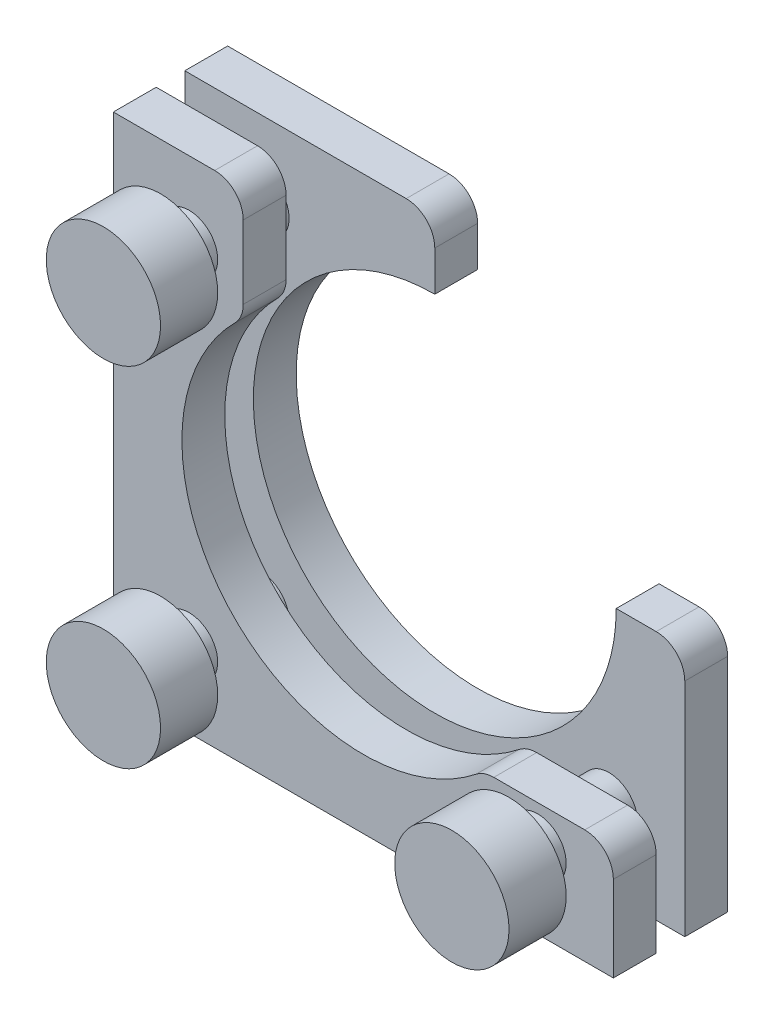
ISO-10303-21;
HEADER;
FILE_DESCRIPTION(('STEP AP214'),'2;1');
FILE_NAME('part.step','',(''),(''),'','','');
FILE_SCHEMA(('AUTOMOTIVE_DESIGN { 1 0 10303 214 1 1 1 1 }'));
ENDSEC;
DATA;
#1=APPLICATION_CONTEXT('core data for automotive mechanical design processes');
#2=APPLICATION_PROTOCOL_DEFINITION('international standard','automotive_design',2000,#1);
#3=PRODUCT_CONTEXT('',#1,'mechanical');
#4=PRODUCT('Part','Part','',(#3));
#5=PRODUCT_RELATED_PRODUCT_CATEGORY('part','',(#4));
#6=PRODUCT_DEFINITION_FORMATION('','',#4);
#7=PRODUCT_DEFINITION_CONTEXT('part definition',#1,'design');
#8=PRODUCT_DEFINITION('design','',#6,#7);
#9=PRODUCT_DEFINITION_SHAPE('','',#8);
#10=(LENGTH_UNIT() NAMED_UNIT(*) SI_UNIT(.MILLI.,.METRE.));
#11=(NAMED_UNIT(*) PLANE_ANGLE_UNIT() SI_UNIT($,.RADIAN.));
#12=(NAMED_UNIT(*) SI_UNIT($,.STERADIAN.) SOLID_ANGLE_UNIT());
#13=UNCERTAINTY_MEASURE_WITH_UNIT(LENGTH_MEASURE(1.E-05),#10,'distance_accuracy_value','');
#14=(GEOMETRIC_REPRESENTATION_CONTEXT(3) GLOBAL_UNCERTAINTY_ASSIGNED_CONTEXT((#13)) GLOBAL_UNIT_ASSIGNED_CONTEXT((#10,
#11,#12)) REPRESENTATION_CONTEXT('',''));
#15=CARTESIAN_POINT('',(0.,0.,0.));
#16=DIRECTION('',(0.,0.,1.));
#17=DIRECTION('',(1.,0.,0.));
#18=AXIS2_PLACEMENT_3D('',#15,#16,#17);
#19=CARTESIAN_POINT('',(0.,0.,3.));
#20=DIRECTION('',(0.,0.,1.));
#21=DIRECTION('',(1.,0.,0.));
#22=AXIS2_PLACEMENT_3D('',#19,#20,#21);
#23=PLANE('',#22);
#24=DIRECTION('',(0.,1.,0.));
#25=VECTOR('',#24,1.);
#26=CARTESIAN_POINT('',(17.5,17.5,3.));
#27=LINE('',#26,#25);
#28=CARTESIAN_POINT('',(17.5,-17.5,3.));
#29=VERTEX_POINT('',#28);
#30=CARTESIAN_POINT('',(17.5,-11.5181144739157,3.));
#31=VERTEX_POINT('',#30);
#32=EDGE_CURVE('E291',#29,#31,#27,.T.);
#33=ORIENTED_EDGE('',*,*,#32,.T.);
#34=CARTESIAN_POINT('',(15.5,-11.5181144739157,3.));
#35=DIRECTION('',(0.,0.,1.));
#36=DIRECTION('',(1.,0.,0.));
#37=AXIS2_PLACEMENT_3D('',#34,#35,#36);
#38=CIRCLE('',#37,2.);
#39=CARTESIAN_POINT('',(15.5,-9.51811447391571,3.));
#40=VERTEX_POINT('',#39);
#41=EDGE_CURVE('E331',#31,#40,#38,.T.);
#42=ORIENTED_EDGE('',*,*,#41,.T.);
#43=DIRECTION('',(1.,0.,0.));
#44=VECTOR('',#43,1.);
#45=CARTESIAN_POINT('',(43.4080614211265,-9.51811447391571,3.));
#46=LINE('',#45,#44);
#47=CARTESIAN_POINT('',(9.13362135003271,-9.51811447391571,3.));
#48=VERTEX_POINT('',#47);
#49=EDGE_CURVE('E208',#48,#40,#46,.T.);
#50=ORIENTED_EDGE('',*,*,#49,.F.);
#51=CARTESIAN_POINT('',(9.13362135003271,-11.5181144739157,3.));
#52=DIRECTION('',(0.,0.,1.));
#53=DIRECTION('',(1.,0.,0.));
#54=AXIS2_PLACEMENT_3D('',#51,#52,#53);
#55=CIRCLE('',#54,2.);
#56=CARTESIAN_POINT('',(7.89095177859969,-9.95102406930133,3.));
#57=VERTEX_POINT('',#56);
#58=EDGE_CURVE('E329',#48,#57,#55,.T.);
#59=ORIENTED_EDGE('',*,*,#58,.T.);
#60=CARTESIAN_POINT('',(0.,0.,3.));
#61=DIRECTION('',(0.,0.,1.));
#62=DIRECTION('',(1.,0.,0.));
#63=AXIS2_PLACEMENT_3D('',#60,#61,#62);
#64=CIRCLE('',#63,12.7);
#65=CARTESIAN_POINT('',(-8.99199864274198,8.96849822483823,3.));
#66=VERTEX_POINT('',#65);
#67=EDGE_CURVE('E284',#66,#57,#64,.T.);
#68=ORIENTED_EDGE('',*,*,#67,.F.);
#69=CARTESIAN_POINT('',(-10.4080614211265,10.3808601500096,3.));
#70=DIRECTION('',(0.,0.,1.));
#71=DIRECTION('',(1.,0.,0.));
#72=AXIS2_PLACEMENT_3D('',#69,#70,#71);
#73=CIRCLE('',#72,2.);
#74=CARTESIAN_POINT('',(-8.40806142112654,10.3808601500096,3.));
#75=VERTEX_POINT('',#74);
#76=EDGE_CURVE('E327',#66,#75,#73,.T.);
#77=ORIENTED_EDGE('',*,*,#76,.T.);
#78=DIRECTION('',(0.,-1.,0.));
#79=VECTOR('',#78,1.);
#80=CARTESIAN_POINT('',(-8.40806142112654,44.5181144739157,3.));
#81=LINE('',#80,#79);
#82=CARTESIAN_POINT('',(-8.40806142112654,15.5,3.));
#83=VERTEX_POINT('',#82);
#84=EDGE_CURVE('E388',#83,#75,#81,.T.);
#85=ORIENTED_EDGE('',*,*,#84,.F.);
#86=CARTESIAN_POINT('',(-10.4080614211265,15.5,3.));
#87=DIRECTION('',(0.,0.,1.));
#88=DIRECTION('',(1.,0.,0.));
#89=AXIS2_PLACEMENT_3D('',#86,#87,#88);
#90=CIRCLE('',#89,2.);
#91=CARTESIAN_POINT('',(-10.4080614211265,17.5,3.));
#92=VERTEX_POINT('',#91);
#93=EDGE_CURVE('E325',#83,#92,#90,.T.);
#94=ORIENTED_EDGE('',*,*,#93,.T.);
#95=DIRECTION('',(-1.,0.,0.));
#96=VECTOR('',#95,1.);
#97=CARTESIAN_POINT('',(-17.5,17.5,3.));
#98=LINE('',#97,#96);
#99=CARTESIAN_POINT('',(-17.5,17.5,3.));
#100=VERTEX_POINT('',#99);
#101=EDGE_CURVE('E294',#92,#100,#98,.T.);
#102=ORIENTED_EDGE('',*,*,#101,.T.);
#103=DIRECTION('',(0.,-1.,0.));
#104=VECTOR('',#103,1.);
#105=CARTESIAN_POINT('',(-17.5,17.5,3.));
#106=LINE('',#105,#104);
#107=CARTESIAN_POINT('',(-17.5,-17.5,3.));
#108=VERTEX_POINT('',#107);
#109=EDGE_CURVE('E297',#100,#108,#106,.T.);
#110=ORIENTED_EDGE('',*,*,#109,.T.);
#111=DIRECTION('',(1.,0.,0.));
#112=VECTOR('',#111,1.);
#113=CARTESIAN_POINT('',(-17.5,-17.5,3.));
#114=LINE('',#113,#112);
#115=EDGE_CURVE('E299',#108,#29,#114,.T.);
#116=ORIENTED_EDGE('',*,*,#115,.T.);
#117=EDGE_LOOP('',(#33,#42,#50,#59,#68,#77,#85,#94,#102,#110,#116));
#118=FACE_BOUND('',#117,.T.);
#119=CARTESIAN_POINT('',(12.1966991411009,-12.1966991411009,3.));
#120=DIRECTION('',(0.,0.,1.));
#121=DIRECTION('',(1.,0.,0.));
#122=AXIS2_PLACEMENT_3D('',#119,#120,#121);
#123=CIRCLE('',#122,2.);
#124=CARTESIAN_POINT('',(14.1966991411009,-12.1966991411009,3.));
#125=VERTEX_POINT('',#124);
#126=EDGE_CURVE('E262',#125,#125,#123,.T.);
#127=ORIENTED_EDGE('',*,*,#126,.F.);
#128=EDGE_LOOP('',(#127));
#129=FACE_BOUND('',#128,.T.);
#130=CARTESIAN_POINT('',(-12.1966991411009,-12.1966991411009,3.));
#131=DIRECTION('',(0.,0.,1.));
#132=DIRECTION('',(1.,0.,0.));
#133=AXIS2_PLACEMENT_3D('',#130,#131,#132);
#134=CIRCLE('',#133,2.);
#135=CARTESIAN_POINT('',(-10.1966991411009,-12.1966991411009,3.));
#136=VERTEX_POINT('',#135);
#137=EDGE_CURVE('E265',#136,#136,#134,.T.);
#138=ORIENTED_EDGE('',*,*,#137,.F.);
#139=EDGE_LOOP('',(#138));
#140=FACE_BOUND('',#139,.T.);
#141=CARTESIAN_POINT('',(-12.1966991411009,12.1966991411009,3.));
#142=DIRECTION('',(0.,0.,1.));
#143=DIRECTION('',(1.,0.,0.));
#144=AXIS2_PLACEMENT_3D('',#141,#142,#143);
#145=CIRCLE('',#144,2.);
#146=CARTESIAN_POINT('',(-10.1966991411009,12.1966991411009,3.));
#147=VERTEX_POINT('',#146);
#148=EDGE_CURVE('E274',#147,#147,#145,.T.);
#149=ORIENTED_EDGE('',*,*,#148,.F.);
#150=EDGE_LOOP('',(#149));
#151=FACE_BOUND('',#150,.T.);
#152=ADVANCED_FACE('F36',(#118,#129,#140,#151),#23,.T.);
#153=CARTESIAN_POINT('',(0.,0.,0.));
#154=DIRECTION('',(0.,0.,1.));
#155=DIRECTION('',(1.,0.,0.));
#156=AXIS2_PLACEMENT_3D('',#153,#154,#155);
#157=PLANE('',#156);
#158=CARTESIAN_POINT('',(12.1966991411009,-12.1966991411009,0.));
#159=DIRECTION('',(0.,0.,1.));
#160=DIRECTION('',(1.,0.,0.));
#161=AXIS2_PLACEMENT_3D('',#158,#159,#160);
#162=CIRCLE('',#161,2.);
#163=CARTESIAN_POINT('',(14.1966991411009,-12.1966991411009,0.));
#164=VERTEX_POINT('',#163);
#165=EDGE_CURVE('E261',#164,#164,#162,.T.);
#166=ORIENTED_EDGE('',*,*,#165,.T.);
#167=EDGE_LOOP('',(#166));
#168=FACE_BOUND('',#167,.T.);
#169=CARTESIAN_POINT('',(-12.1966991411009,-12.1966991411009,0.));
#170=DIRECTION('',(0.,0.,1.));
#171=DIRECTION('',(1.,0.,0.));
#172=AXIS2_PLACEMENT_3D('',#169,#170,#171);
#173=CIRCLE('',#172,2.);
#174=CARTESIAN_POINT('',(-10.1966991411009,-12.1966991411009,0.));
#175=VERTEX_POINT('',#174);
#176=EDGE_CURVE('E271',#175,#175,#173,.T.);
#177=ORIENTED_EDGE('',*,*,#176,.T.);
#178=EDGE_LOOP('',(#177));
#179=FACE_BOUND('',#178,.T.);
#180=CARTESIAN_POINT('',(-12.1966991411009,12.1966991411009,0.));
#181=DIRECTION('',(0.,0.,1.));
#182=DIRECTION('',(1.,0.,0.));
#183=AXIS2_PLACEMENT_3D('',#180,#181,#182);
#184=CIRCLE('',#183,2.);
#185=CARTESIAN_POINT('',(-10.1966991411009,12.1966991411009,0.));
#186=VERTEX_POINT('',#185);
#187=EDGE_CURVE('E278',#186,#186,#184,.T.);
#188=ORIENTED_EDGE('',*,*,#187,.T.);
#189=EDGE_LOOP('',(#188));
#190=FACE_BOUND('',#189,.T.);
#191=DIRECTION('',(1.,0.,0.));
#192=VECTOR('',#191,1.);
#193=CARTESIAN_POINT('',(43.4080614211265,-9.51811447391571,0.));
#194=LINE('',#193,#192);
#195=CARTESIAN_POINT('',(9.13362135003271,-9.51811447391571,0.));
#196=VERTEX_POINT('',#195);
#197=CARTESIAN_POINT('',(15.5,-9.51811447391571,0.));
#198=VERTEX_POINT('',#197);
#199=EDGE_CURVE('E205',#196,#198,#194,.T.);
#200=ORIENTED_EDGE('',*,*,#199,.T.);
#201=CARTESIAN_POINT('',(15.5,-11.5181144739157,0.));
#202=DIRECTION('',(0.,0.,1.));
#203=DIRECTION('',(1.,0.,0.));
#204=AXIS2_PLACEMENT_3D('',#201,#202,#203);
#205=CIRCLE('',#204,2.);
#206=CARTESIAN_POINT('',(17.5,-11.5181144739157,0.));
#207=VERTEX_POINT('',#206);
#208=EDGE_CURVE('E344',#198,#207,#205,.F.);
#209=ORIENTED_EDGE('',*,*,#208,.T.);
#210=DIRECTION('',(0.,1.,0.));
#211=VECTOR('',#210,1.);
#212=CARTESIAN_POINT('',(17.5,17.5,0.));
#213=LINE('',#212,#211);
#214=CARTESIAN_POINT('',(17.5,-17.5,0.));
#215=VERTEX_POINT('',#214);
#216=EDGE_CURVE('E287',#215,#207,#213,.T.);
#217=ORIENTED_EDGE('',*,*,#216,.F.);
#218=DIRECTION('',(1.,0.,0.));
#219=VECTOR('',#218,1.);
#220=CARTESIAN_POINT('',(-17.5,-17.5,0.));
#221=LINE('',#220,#219);
#222=CARTESIAN_POINT('',(-17.5,-17.5,0.));
#223=VERTEX_POINT('',#222);
#224=EDGE_CURVE('E295',#223,#215,#221,.T.);
#225=ORIENTED_EDGE('',*,*,#224,.F.);
#226=DIRECTION('',(0.,-1.,0.));
#227=VECTOR('',#226,1.);
#228=CARTESIAN_POINT('',(-17.5,17.5,0.));
#229=LINE('',#228,#227);
#230=CARTESIAN_POINT('',(-17.5,17.5,0.));
#231=VERTEX_POINT('',#230);
#232=EDGE_CURVE('E306',#231,#223,#229,.T.);
#233=ORIENTED_EDGE('',*,*,#232,.F.);
#234=DIRECTION('',(-1.,0.,0.));
#235=VECTOR('',#234,1.);
#236=CARTESIAN_POINT('',(-17.5,17.5,0.));
#237=LINE('',#236,#235);
#238=CARTESIAN_POINT('',(-10.4080614211265,17.5,0.));
#239=VERTEX_POINT('',#238);
#240=EDGE_CURVE('E304',#239,#231,#237,.T.);
#241=ORIENTED_EDGE('',*,*,#240,.F.);
#242=CARTESIAN_POINT('',(-10.4080614211265,15.5,0.));
#243=DIRECTION('',(0.,0.,1.));
#244=DIRECTION('',(1.,0.,0.));
#245=AXIS2_PLACEMENT_3D('',#242,#243,#244);
#246=CIRCLE('',#245,2.);
#247=CARTESIAN_POINT('',(-8.40806142112654,15.5,0.));
#248=VERTEX_POINT('',#247);
#249=EDGE_CURVE('E338',#239,#248,#246,.F.);
#250=ORIENTED_EDGE('',*,*,#249,.T.);
#251=DIRECTION('',(0.,-1.,0.));
#252=VECTOR('',#251,1.);
#253=CARTESIAN_POINT('',(-8.40806142112654,44.5181144739157,0.));
#254=LINE('',#253,#252);
#255=CARTESIAN_POINT('',(-8.40806142112654,10.3808601500096,0.));
#256=VERTEX_POINT('',#255);
#257=EDGE_CURVE('E392',#248,#256,#254,.T.);
#258=ORIENTED_EDGE('',*,*,#257,.T.);
#259=CARTESIAN_POINT('',(-10.4080614211265,10.3808601500096,0.));
#260=DIRECTION('',(0.,0.,1.));
#261=DIRECTION('',(1.,0.,0.));
#262=AXIS2_PLACEMENT_3D('',#259,#260,#261);
#263=CIRCLE('',#262,2.);
#264=CARTESIAN_POINT('',(-8.99199864274198,8.96849822483823,0.));
#265=VERTEX_POINT('',#264);
#266=EDGE_CURVE('E340',#256,#265,#263,.F.);
#267=ORIENTED_EDGE('',*,*,#266,.T.);
#268=CARTESIAN_POINT('',(0.,0.,0.));
#269=DIRECTION('',(0.,0.,1.));
#270=DIRECTION('',(1.,0.,0.));
#271=AXIS2_PLACEMENT_3D('',#268,#269,#270);
#272=CIRCLE('',#271,12.7);
#273=CARTESIAN_POINT('',(7.89095177859969,-9.95102406930133,0.));
#274=VERTEX_POINT('',#273);
#275=EDGE_CURVE('E288',#265,#274,#272,.T.);
#276=ORIENTED_EDGE('',*,*,#275,.T.);
#277=CARTESIAN_POINT('',(9.13362135003271,-11.5181144739157,0.));
#278=DIRECTION('',(0.,0.,1.));
#279=DIRECTION('',(1.,0.,0.));
#280=AXIS2_PLACEMENT_3D('',#277,#278,#279);
#281=CIRCLE('',#280,2.);
#282=EDGE_CURVE('E342',#274,#196,#281,.F.);
#283=ORIENTED_EDGE('',*,*,#282,.T.);
#284=EDGE_LOOP('',(#200,#209,#217,#225,#233,#241,#250,#258,#267,#276,#283));
#285=FACE_BOUND('',#284,.T.);
#286=ADVANCED_FACE('F414',(#168,#179,#190,#285),#157,.F.);
#287=CARTESIAN_POINT('',(17.5,17.5,3.));
#288=DIRECTION('',(-1.,0.,0.));
#289=DIRECTION('',(0.,-1.,0.));
#290=AXIS2_PLACEMENT_3D('',#287,#288,#289);
#291=PLANE('',#290);
#292=ORIENTED_EDGE('',*,*,#216,.T.);
#293=DIRECTION('',(0.,0.,1.));
#294=VECTOR('',#293,1.);
#295=CARTESIAN_POINT('',(17.5,-11.5181144739157,3.));
#296=LINE('',#295,#294);
#297=EDGE_CURVE('E183',#207,#31,#296,.T.);
#298=ORIENTED_EDGE('',*,*,#297,.T.);
#299=ORIENTED_EDGE('',*,*,#32,.F.);
#300=DIRECTION('',(0.,0.,-1.));
#301=VECTOR('',#300,1.);
#302=CARTESIAN_POINT('',(17.5,-17.5,3.));
#303=LINE('',#302,#301);
#304=EDGE_CURVE('E301',#29,#215,#303,.T.);
#305=ORIENTED_EDGE('',*,*,#304,.T.);
#306=EDGE_LOOP('',(#292,#298,#299,#305));
#307=FACE_BOUND('',#306,.T.);
#308=ADVANCED_FACE('F417',(#307),#291,.F.);
#309=CARTESIAN_POINT('',(-17.5,17.5,3.));
#310=DIRECTION('',(0.,-1.,0.));
#311=DIRECTION('',(0.,0.,-1.));
#312=AXIS2_PLACEMENT_3D('',#309,#310,#311);
#313=PLANE('',#312);
#314=ORIENTED_EDGE('',*,*,#101,.F.);
#315=DIRECTION('',(0.,0.,-1.));
#316=VECTOR('',#315,1.);
#317=CARTESIAN_POINT('',(-10.4080614211265,17.5,3.));
#318=LINE('',#317,#316);
#319=EDGE_CURVE('E355',#92,#239,#318,.T.);
#320=ORIENTED_EDGE('',*,*,#319,.T.);
#321=ORIENTED_EDGE('',*,*,#240,.T.);
#322=DIRECTION('',(0.,0.,-1.));
#323=VECTOR('',#322,1.);
#324=CARTESIAN_POINT('',(-17.5,17.5,3.));
#325=LINE('',#324,#323);
#326=EDGE_CURVE('E283',#100,#231,#325,.T.);
#327=ORIENTED_EDGE('',*,*,#326,.F.);
#328=EDGE_LOOP('',(#314,#320,#321,#327));
#329=FACE_BOUND('',#328,.T.);
#330=ADVANCED_FACE('F432',(#329),#313,.F.);
#331=CARTESIAN_POINT('',(-17.5,17.5,3.));
#332=DIRECTION('',(1.,0.,0.));
#333=DIRECTION('',(0.,1.,0.));
#334=AXIS2_PLACEMENT_3D('',#331,#332,#333);
#335=PLANE('',#334);
#336=ORIENTED_EDGE('',*,*,#232,.T.);
#337=DIRECTION('',(0.,0.,-1.));
#338=VECTOR('',#337,1.);
#339=CARTESIAN_POINT('',(-17.5,-17.5,3.));
#340=LINE('',#339,#338);
#341=EDGE_CURVE('E311',#108,#223,#340,.T.);
#342=ORIENTED_EDGE('',*,*,#341,.F.);
#343=ORIENTED_EDGE('',*,*,#109,.F.);
#344=ORIENTED_EDGE('',*,*,#326,.T.);
#345=EDGE_LOOP('',(#336,#342,#343,#344));
#346=FACE_BOUND('',#345,.T.);
#347=ADVANCED_FACE('F427',(#346),#335,.F.);
#348=CARTESIAN_POINT('',(-17.5,-17.5,3.));
#349=DIRECTION('',(0.,1.,0.));
#350=DIRECTION('',(0.,0.,1.));
#351=AXIS2_PLACEMENT_3D('',#348,#349,#350);
#352=PLANE('',#351);
#353=ORIENTED_EDGE('',*,*,#224,.T.);
#354=ORIENTED_EDGE('',*,*,#304,.F.);
#355=ORIENTED_EDGE('',*,*,#115,.F.);
#356=ORIENTED_EDGE('',*,*,#341,.T.);
#357=EDGE_LOOP('',(#353,#354,#355,#356));
#358=FACE_BOUND('',#357,.T.);
#359=ADVANCED_FACE('F422',(#358),#352,.F.);
#360=CARTESIAN_POINT('',(0.,0.,3.));
#361=DIRECTION('',(0.,0.,-1.));
#362=DIRECTION('',(-1.,0.,0.));
#363=AXIS2_PLACEMENT_3D('',#360,#361,#362);
#364=CYLINDRICAL_SURFACE('',#363,12.7);
#365=ORIENTED_EDGE('',*,*,#67,.T.);
#366=DIRECTION('',(0.,0.,-1.));
#367=VECTOR('',#366,1.);
#368=CARTESIAN_POINT('',(7.89095177859969,-9.95102406930133,3.));
#369=LINE('',#368,#367);
#370=EDGE_CURVE('E348',#57,#274,#369,.T.);
#371=ORIENTED_EDGE('',*,*,#370,.T.);
#372=ORIENTED_EDGE('',*,*,#275,.F.);
#373=DIRECTION('',(0.,0.,-1.));
#374=VECTOR('',#373,1.);
#375=CARTESIAN_POINT('',(-8.99199864274198,8.96849822483823,3.));
#376=LINE('',#375,#374);
#377=EDGE_CURVE('E346',#265,#66,#376,.F.);
#378=ORIENTED_EDGE('',*,*,#377,.T.);
#379=EDGE_LOOP('',(#365,#371,#372,#378));
#380=FACE_BOUND('',#379,.T.);
#381=ADVANCED_FACE('F447',(#380),#364,.F.);
#382=CARTESIAN_POINT('',(-12.1966991411009,12.1966991411009,-2.));
#383=DIRECTION('',(0.,0.,1.));
#384=DIRECTION('',(1.,0.,0.));
#385=AXIS2_PLACEMENT_3D('',#382,#383,#384);
#386=CYLINDRICAL_SURFACE('',#385,2.);
#387=CARTESIAN_POINT('',(-12.1966991411009,12.1966991411009,-2.));
#388=DIRECTION('',(0.,0.,1.));
#389=DIRECTION('',(1.,0.,0.));
#390=AXIS2_PLACEMENT_3D('',#387,#388,#389);
#391=CIRCLE('',#390,2.);
#392=CARTESIAN_POINT('',(-10.1966991411009,12.1966991411009,-2.));
#393=VERTEX_POINT('',#392);
#394=EDGE_CURVE('E243',#393,#393,#391,.T.);
#395=ORIENTED_EDGE('',*,*,#394,.T.);
#396=EDGE_LOOP('',(#395));
#397=FACE_BOUND('',#396,.T.);
#398=ORIENTED_EDGE('',*,*,#187,.F.);
#399=EDGE_LOOP('',(#398));
#400=FACE_BOUND('',#399,.T.);
#401=ADVANCED_FACE('F465',(#397,#400),#386,.T.);
#402=ORIENTED_EDGE('',*,*,#148,.T.);
#403=EDGE_LOOP('',(#402));
#404=FACE_BOUND('',#403,.T.);
#405=CARTESIAN_POINT('',(-12.1966991411009,12.1966991411009,5.));
#406=DIRECTION('',(0.,0.,1.));
#407=DIRECTION('',(1.,0.,0.));
#408=AXIS2_PLACEMENT_3D('',#405,#406,#407);
#409=CIRCLE('',#408,2.);
#410=CARTESIAN_POINT('',(-10.1966991411009,12.1966991411009,5.));
#411=VERTEX_POINT('',#410);
#412=EDGE_CURVE('E275',#411,#411,#409,.T.);
#413=ORIENTED_EDGE('',*,*,#412,.F.);
#414=EDGE_LOOP('',(#413));
#415=FACE_BOUND('',#414,.T.);
#416=ADVANCED_FACE('F461',(#404,#415),#386,.T.);
#417=CARTESIAN_POINT('',(-12.1966991411009,-12.1966991411009,-2.));
#418=DIRECTION('',(0.,0.,1.));
#419=DIRECTION('',(1.,0.,0.));
#420=AXIS2_PLACEMENT_3D('',#417,#418,#419);
#421=CYLINDRICAL_SURFACE('',#420,2.);
#422=CARTESIAN_POINT('',(-12.1966991411009,-12.1966991411009,-2.));
#423=DIRECTION('',(0.,0.,1.));
#424=DIRECTION('',(1.,0.,0.));
#425=AXIS2_PLACEMENT_3D('',#422,#423,#424);
#426=CIRCLE('',#425,2.);
#427=CARTESIAN_POINT('',(-10.1966991411009,-12.1966991411009,-2.));
#428=VERTEX_POINT('',#427);
#429=EDGE_CURVE('E258',#428,#428,#426,.T.);
#430=ORIENTED_EDGE('',*,*,#429,.T.);
#431=EDGE_LOOP('',(#430));
#432=FACE_BOUND('',#431,.T.);
#433=ORIENTED_EDGE('',*,*,#176,.F.);
#434=EDGE_LOOP('',(#433));
#435=FACE_BOUND('',#434,.T.);
#436=ADVANCED_FACE('F464',(#432,#435),#421,.T.);
#437=ORIENTED_EDGE('',*,*,#137,.T.);
#438=EDGE_LOOP('',(#437));
#439=FACE_BOUND('',#438,.T.);
#440=CARTESIAN_POINT('',(-12.1966991411009,-12.1966991411009,5.));
#441=DIRECTION('',(0.,0.,1.));
#442=DIRECTION('',(1.,0.,0.));
#443=AXIS2_PLACEMENT_3D('',#440,#441,#442);
#444=CIRCLE('',#443,2.);
#445=CARTESIAN_POINT('',(-10.1966991411009,-12.1966991411009,5.));
#446=VERTEX_POINT('',#445);
#447=EDGE_CURVE('E268',#446,#446,#444,.T.);
#448=ORIENTED_EDGE('',*,*,#447,.F.);
#449=EDGE_LOOP('',(#448));
#450=FACE_BOUND('',#449,.T.);
#451=ADVANCED_FACE('F493',(#439,#450),#421,.T.);
#452=CARTESIAN_POINT('',(12.1966991411009,-12.1966991411009,-2.));
#453=DIRECTION('',(0.,0.,1.));
#454=DIRECTION('',(1.,0.,0.));
#455=AXIS2_PLACEMENT_3D('',#452,#453,#454);
#456=CYLINDRICAL_SURFACE('',#455,2.);
#457=CARTESIAN_POINT('',(12.1966991411009,-12.1966991411009,-2.));
#458=DIRECTION('',(0.,0.,1.));
#459=DIRECTION('',(1.,0.,0.));
#460=AXIS2_PLACEMENT_3D('',#457,#458,#459);
#461=CIRCLE('',#460,2.);
#462=CARTESIAN_POINT('',(14.1966991411009,-12.1966991411009,-2.));
#463=VERTEX_POINT('',#462);
#464=EDGE_CURVE('E235',#463,#463,#461,.T.);
#465=ORIENTED_EDGE('',*,*,#464,.T.);
#466=EDGE_LOOP('',(#465));
#467=FACE_BOUND('',#466,.T.);
#468=ORIENTED_EDGE('',*,*,#165,.F.);
#469=EDGE_LOOP('',(#468));
#470=FACE_BOUND('',#469,.T.);
#471=ADVANCED_FACE('F488',(#467,#470),#456,.T.);
#472=ORIENTED_EDGE('',*,*,#126,.T.);
#473=EDGE_LOOP('',(#472));
#474=FACE_BOUND('',#473,.T.);
#475=CARTESIAN_POINT('',(12.1966991411009,-12.1966991411009,5.));
#476=DIRECTION('',(0.,0.,1.));
#477=DIRECTION('',(1.,0.,0.));
#478=AXIS2_PLACEMENT_3D('',#475,#476,#477);
#479=CIRCLE('',#478,2.);
#480=CARTESIAN_POINT('',(14.1966991411009,-12.1966991411009,5.));
#481=VERTEX_POINT('',#480);
#482=EDGE_CURVE('E253',#481,#481,#479,.T.);
#483=ORIENTED_EDGE('',*,*,#482,.F.);
#484=EDGE_LOOP('',(#483));
#485=FACE_BOUND('',#484,.T.);
#486=ADVANCED_FACE('F479',(#474,#485),#456,.T.);
#487=CARTESIAN_POINT('',(-12.1966991411009,12.1966991411009,9.));
#488=DIRECTION('',(0.,0.,-1.));
#489=DIRECTION('',(-1.,0.,0.));
#490=AXIS2_PLACEMENT_3D('',#487,#488,#489);
#491=CYLINDRICAL_SURFACE('',#490,4.);
#492=CARTESIAN_POINT('',(-12.1966991411009,12.1966991411009,9.));
#493=DIRECTION('',(0.,0.,1.));
#494=DIRECTION('',(1.,0.,0.));
#495=AXIS2_PLACEMENT_3D('',#492,#493,#494);
#496=CIRCLE('',#495,4.);
#497=CARTESIAN_POINT('',(-8.1966991411009,12.1966991411009,9.));
#498=VERTEX_POINT('',#497);
#499=EDGE_CURVE('E250',#498,#498,#496,.T.);
#500=ORIENTED_EDGE('',*,*,#499,.F.);
#501=EDGE_LOOP('',(#500));
#502=FACE_BOUND('',#501,.T.);
#503=CARTESIAN_POINT('',(-12.1966991411009,12.1966991411009,5.));
#504=DIRECTION('',(0.,0.,1.));
#505=DIRECTION('',(1.,0.,0.));
#506=AXIS2_PLACEMENT_3D('',#503,#504,#505);
#507=CIRCLE('',#506,4.);
#508=CARTESIAN_POINT('',(-8.1966991411009,12.1966991411009,5.));
#509=VERTEX_POINT('',#508);
#510=EDGE_CURVE('E247',#509,#509,#507,.T.);
#511=ORIENTED_EDGE('',*,*,#510,.T.);
#512=EDGE_LOOP('',(#511));
#513=FACE_BOUND('',#512,.T.);
#514=ADVANCED_FACE('F477',(#502,#513),#491,.T.);
#515=CARTESIAN_POINT('',(-12.1966991411009,12.1966991411009,9.));
#516=DIRECTION('',(0.,0.,1.));
#517=DIRECTION('',(1.,0.,0.));
#518=AXIS2_PLACEMENT_3D('',#515,#516,#517);
#519=PLANE('',#518);
#520=ORIENTED_EDGE('',*,*,#499,.T.);
#521=EDGE_LOOP('',(#520));
#522=FACE_BOUND('',#521,.T.);
#523=ADVANCED_FACE('F473',(#522),#519,.T.);
#524=CARTESIAN_POINT('',(-12.1966991411009,12.1966991411009,5.));
#525=DIRECTION('',(0.,0.,1.));
#526=DIRECTION('',(1.,0.,0.));
#527=AXIS2_PLACEMENT_3D('',#524,#525,#526);
#528=PLANE('',#527);
#529=ORIENTED_EDGE('',*,*,#412,.T.);
#530=EDGE_LOOP('',(#529));
#531=FACE_BOUND('',#530,.T.);
#532=ORIENTED_EDGE('',*,*,#510,.F.);
#533=EDGE_LOOP('',(#532));
#534=FACE_BOUND('',#533,.T.);
#535=ADVANCED_FACE('F469',(#531,#534),#528,.F.);
#536=CARTESIAN_POINT('',(-12.1966991411009,-12.1966991411009,9.));
#537=DIRECTION('',(0.,0.,-1.));
#538=DIRECTION('',(-1.,0.,0.));
#539=AXIS2_PLACEMENT_3D('',#536,#537,#538);
#540=CYLINDRICAL_SURFACE('',#539,4.);
#541=CARTESIAN_POINT('',(-12.1966991411009,-12.1966991411009,9.));
#542=DIRECTION('',(0.,0.,1.));
#543=DIRECTION('',(1.,0.,0.));
#544=AXIS2_PLACEMENT_3D('',#541,#542,#543);
#545=CIRCLE('',#544,4.);
#546=CARTESIAN_POINT('',(-8.1966991411009,-12.1966991411009,9.));
#547=VERTEX_POINT('',#546);
#548=EDGE_CURVE('E244',#547,#547,#545,.T.);
#549=ORIENTED_EDGE('',*,*,#548,.F.);
#550=EDGE_LOOP('',(#549));
#551=FACE_BOUND('',#550,.T.);
#552=CARTESIAN_POINT('',(-12.1966991411009,-12.1966991411009,5.));
#553=DIRECTION('',(0.,0.,1.));
#554=DIRECTION('',(1.,0.,0.));
#555=AXIS2_PLACEMENT_3D('',#552,#553,#554);
#556=CIRCLE('',#555,4.);
#557=CARTESIAN_POINT('',(-8.1966991411009,-12.1966991411009,5.));
#558=VERTEX_POINT('',#557);
#559=EDGE_CURVE('E239',#558,#558,#556,.T.);
#560=ORIENTED_EDGE('',*,*,#559,.T.);
#561=EDGE_LOOP('',(#560));
#562=FACE_BOUND('',#561,.T.);
#563=ADVANCED_FACE('F472',(#551,#562),#540,.T.);
#564=CARTESIAN_POINT('',(-12.1966991411009,-12.1966991411009,9.));
#565=DIRECTION('',(0.,0.,1.));
#566=DIRECTION('',(1.,0.,0.));
#567=AXIS2_PLACEMENT_3D('',#564,#565,#566);
#568=PLANE('',#567);
#569=ORIENTED_EDGE('',*,*,#548,.T.);
#570=EDGE_LOOP('',(#569));
#571=FACE_BOUND('',#570,.T.);
#572=ADVANCED_FACE('F550',(#571),#568,.T.);
#573=CARTESIAN_POINT('',(-12.1966991411009,-12.1966991411009,5.));
#574=DIRECTION('',(0.,0.,1.));
#575=DIRECTION('',(1.,0.,0.));
#576=AXIS2_PLACEMENT_3D('',#573,#574,#575);
#577=PLANE('',#576);
#578=ORIENTED_EDGE('',*,*,#447,.T.);
#579=EDGE_LOOP('',(#578));
#580=FACE_BOUND('',#579,.T.);
#581=ORIENTED_EDGE('',*,*,#559,.F.);
#582=EDGE_LOOP('',(#581));
#583=FACE_BOUND('',#582,.T.);
#584=ADVANCED_FACE('F548',(#580,#583),#577,.F.);
#585=CARTESIAN_POINT('',(12.1966991411009,-12.1966991411009,9.));
#586=DIRECTION('',(0.,0.,-1.));
#587=DIRECTION('',(-1.,0.,0.));
#588=AXIS2_PLACEMENT_3D('',#585,#586,#587);
#589=CYLINDRICAL_SURFACE('',#588,4.);
#590=CARTESIAN_POINT('',(12.1966991411009,-12.1966991411009,9.));
#591=DIRECTION('',(0.,0.,1.));
#592=DIRECTION('',(1.,0.,0.));
#593=AXIS2_PLACEMENT_3D('',#590,#591,#592);
#594=CIRCLE('',#593,4.);
#595=CARTESIAN_POINT('',(16.1966991411009,-12.1966991411009,9.));
#596=VERTEX_POINT('',#595);
#597=EDGE_CURVE('E236',#596,#596,#594,.T.);
#598=ORIENTED_EDGE('',*,*,#597,.F.);
#599=EDGE_LOOP('',(#598));
#600=FACE_BOUND('',#599,.T.);
#601=CARTESIAN_POINT('',(12.1966991411009,-12.1966991411009,5.));
#602=DIRECTION('',(0.,0.,1.));
#603=DIRECTION('',(1.,0.,0.));
#604=AXIS2_PLACEMENT_3D('',#601,#602,#603);
#605=CIRCLE('',#604,4.);
#606=CARTESIAN_POINT('',(16.1966991411009,-12.1966991411009,5.));
#607=VERTEX_POINT('',#606);
#608=EDGE_CURVE('E240',#607,#607,#605,.T.);
#609=ORIENTED_EDGE('',*,*,#608,.T.);
#610=EDGE_LOOP('',(#609));
#611=FACE_BOUND('',#610,.T.);
#612=ADVANCED_FACE('F541',(#600,#611),#589,.T.);
#613=CARTESIAN_POINT('',(12.1966991411009,-12.1966991411009,9.));
#614=DIRECTION('',(0.,0.,1.));
#615=DIRECTION('',(1.,0.,0.));
#616=AXIS2_PLACEMENT_3D('',#613,#614,#615);
#617=PLANE('',#616);
#618=ORIENTED_EDGE('',*,*,#597,.T.);
#619=EDGE_LOOP('',(#618));
#620=FACE_BOUND('',#619,.T.);
#621=ADVANCED_FACE('F537',(#620),#617,.T.);
#622=CARTESIAN_POINT('',(12.1966991411009,-12.1966991411009,5.));
#623=DIRECTION('',(0.,0.,1.));
#624=DIRECTION('',(1.,0.,0.));
#625=AXIS2_PLACEMENT_3D('',#622,#623,#624);
#626=PLANE('',#625);
#627=ORIENTED_EDGE('',*,*,#482,.T.);
#628=EDGE_LOOP('',(#627));
#629=FACE_BOUND('',#628,.T.);
#630=ORIENTED_EDGE('',*,*,#608,.F.);
#631=EDGE_LOOP('',(#630));
#632=FACE_BOUND('',#631,.T.);
#633=ADVANCED_FACE('F540',(#629,#632),#626,.F.);
#634=CARTESIAN_POINT('',(0.,0.,-5.));
#635=DIRECTION('',(0.,0.,1.));
#636=DIRECTION('',(1.,0.,0.));
#637=AXIS2_PLACEMENT_3D('',#634,#635,#636);
#638=PLANE('',#637);
#639=DIRECTION('',(1.,0.,0.));
#640=VECTOR('',#639,1.);
#641=CARTESIAN_POINT('',(17.5,17.5,-5.));
#642=LINE('',#641,#640);
#643=CARTESIAN_POINT('',(-17.5,17.5,-5.));
#644=VERTEX_POINT('',#643);
#645=CARTESIAN_POINT('',(-1.99999999999999,17.5,-5.));
#646=VERTEX_POINT('',#645);
#647=EDGE_CURVE('E214',#644,#646,#642,.T.);
#648=ORIENTED_EDGE('',*,*,#647,.T.);
#649=CARTESIAN_POINT('',(-1.99999999999999,15.5,-5.));
#650=DIRECTION('',(0.,0.,1.));
#651=DIRECTION('',(1.,0.,0.));
#652=AXIS2_PLACEMENT_3D('',#649,#650,#651);
#653=CIRCLE('',#652,2.);
#654=CARTESIAN_POINT('',(0.,15.5,-5.));
#655=VERTEX_POINT('',#654);
#656=EDGE_CURVE('E192',#646,#655,#653,.F.);
#657=ORIENTED_EDGE('',*,*,#656,.T.);
#658=DIRECTION('',(0.,1.,0.));
#659=VECTOR('',#658,1.);
#660=CARTESIAN_POINT('',(0.,35.,-5.));
#661=LINE('',#660,#659);
#662=CARTESIAN_POINT('',(0.,12.7,-5.));
#663=VERTEX_POINT('',#662);
#664=EDGE_CURVE('E175',#663,#655,#661,.T.);
#665=ORIENTED_EDGE('',*,*,#664,.F.);
#666=CARTESIAN_POINT('',(0.,0.,-5.));
#667=DIRECTION('',(0.,0.,-1.));
#668=DIRECTION('',(-1.,0.,0.));
#669=AXIS2_PLACEMENT_3D('',#666,#667,#668);
#670=CIRCLE('',#669,12.7);
#671=CARTESIAN_POINT('',(12.7,0.,-5.));
#672=VERTEX_POINT('',#671);
#673=EDGE_CURVE('E191',#672,#663,#670,.T.);
#674=ORIENTED_EDGE('',*,*,#673,.F.);
#675=DIRECTION('',(-1.,0.,0.));
#676=VECTOR('',#675,1.);
#677=CARTESIAN_POINT('',(0.,0.,-5.));
#678=LINE('',#677,#676);
#679=CARTESIAN_POINT('',(15.5,0.,-5.));
#680=VERTEX_POINT('',#679);
#681=EDGE_CURVE('E194',#680,#672,#678,.T.);
#682=ORIENTED_EDGE('',*,*,#681,.F.);
#683=CARTESIAN_POINT('',(15.5,-1.99999999999999,-5.));
#684=DIRECTION('',(0.,0.,1.));
#685=DIRECTION('',(1.,0.,0.));
#686=AXIS2_PLACEMENT_3D('',#683,#684,#685);
#687=CIRCLE('',#686,2.);
#688=CARTESIAN_POINT('',(17.5,-1.99999999999999,-5.));
#689=VERTEX_POINT('',#688);
#690=EDGE_CURVE('E361',#680,#689,#687,.F.);
#691=ORIENTED_EDGE('',*,*,#690,.T.);
#692=DIRECTION('',(0.,-1.,0.));
#693=VECTOR('',#692,1.);
#694=CARTESIAN_POINT('',(17.5,-17.5,-5.));
#695=LINE('',#694,#693);
#696=CARTESIAN_POINT('',(17.5,-17.5,-5.));
#697=VERTEX_POINT('',#696);
#698=EDGE_CURVE('E217',#689,#697,#695,.T.);
#699=ORIENTED_EDGE('',*,*,#698,.T.);
#700=DIRECTION('',(-1.,0.,0.));
#701=VECTOR('',#700,1.);
#702=CARTESIAN_POINT('',(17.5,-17.5,-5.));
#703=LINE('',#702,#701);
#704=CARTESIAN_POINT('',(-17.5,-17.5,-5.));
#705=VERTEX_POINT('',#704);
#706=EDGE_CURVE('E219',#697,#705,#703,.T.);
#707=ORIENTED_EDGE('',*,*,#706,.T.);
#708=DIRECTION('',(0.,1.,0.));
#709=VECTOR('',#708,1.);
#710=CARTESIAN_POINT('',(-17.5,-17.5,-5.));
#711=LINE('',#710,#709);
#712=EDGE_CURVE('E211',#705,#644,#711,.T.);
#713=ORIENTED_EDGE('',*,*,#712,.T.);
#714=EDGE_LOOP('',(#648,#657,#665,#674,#682,#691,#699,#707,#713));
#715=FACE_BOUND('',#714,.T.);
#716=ADVANCED_FACE('F189',(#715),#638,.F.);
#717=CARTESIAN_POINT('',(0.,0.,-2.));
#718=DIRECTION('',(0.,0.,1.));
#719=DIRECTION('',(1.,0.,0.));
#720=AXIS2_PLACEMENT_3D('',#717,#718,#719);
#721=PLANE('',#720);
#722=DIRECTION('',(0.,1.,0.));
#723=VECTOR('',#722,1.);
#724=CARTESIAN_POINT('',(0.,35.,-2.));
#725=LINE('',#724,#723);
#726=CARTESIAN_POINT('',(0.,12.7,-2.));
#727=VERTEX_POINT('',#726);
#728=CARTESIAN_POINT('',(0.,15.5,-2.));
#729=VERTEX_POINT('',#728);
#730=EDGE_CURVE('E178',#727,#729,#725,.T.);
#731=ORIENTED_EDGE('',*,*,#730,.T.);
#732=CARTESIAN_POINT('',(-1.99999999999999,15.5,-2.));
#733=DIRECTION('',(0.,0.,1.));
#734=DIRECTION('',(1.,0.,0.));
#735=AXIS2_PLACEMENT_3D('',#732,#733,#734);
#736=CIRCLE('',#735,2.);
#737=CARTESIAN_POINT('',(-1.99999999999999,17.5,-2.));
#738=VERTEX_POINT('',#737);
#739=EDGE_CURVE('E367',#729,#738,#736,.T.);
#740=ORIENTED_EDGE('',*,*,#739,.T.);
#741=DIRECTION('',(1.,0.,0.));
#742=VECTOR('',#741,1.);
#743=CARTESIAN_POINT('',(17.5,17.5,-2.));
#744=LINE('',#743,#742);
#745=CARTESIAN_POINT('',(-17.5,17.5,-2.));
#746=VERTEX_POINT('',#745);
#747=EDGE_CURVE('E203',#746,#738,#744,.T.);
#748=ORIENTED_EDGE('',*,*,#747,.F.);
#749=DIRECTION('',(0.,1.,0.));
#750=VECTOR('',#749,1.);
#751=CARTESIAN_POINT('',(-17.5,-17.5,-2.));
#752=LINE('',#751,#750);
#753=CARTESIAN_POINT('',(-17.5,-17.5,-2.));
#754=VERTEX_POINT('',#753);
#755=EDGE_CURVE('E199',#754,#746,#752,.T.);
#756=ORIENTED_EDGE('',*,*,#755,.F.);
#757=DIRECTION('',(-1.,0.,0.));
#758=VECTOR('',#757,1.);
#759=CARTESIAN_POINT('',(17.5,-17.5,-2.));
#760=LINE('',#759,#758);
#761=CARTESIAN_POINT('',(17.5,-17.5,-2.));
#762=VERTEX_POINT('',#761);
#763=EDGE_CURVE('E215',#762,#754,#760,.T.);
#764=ORIENTED_EDGE('',*,*,#763,.F.);
#765=DIRECTION('',(0.,-1.,0.));
#766=VECTOR('',#765,1.);
#767=CARTESIAN_POINT('',(17.5,-17.5,-2.));
#768=LINE('',#767,#766);
#769=CARTESIAN_POINT('',(17.5,-1.99999999999999,-2.));
#770=VERTEX_POINT('',#769);
#771=EDGE_CURVE('E224',#770,#762,#768,.T.);
#772=ORIENTED_EDGE('',*,*,#771,.F.);
#773=CARTESIAN_POINT('',(15.5,-1.99999999999999,-2.));
#774=DIRECTION('',(0.,0.,1.));
#775=DIRECTION('',(1.,0.,0.));
#776=AXIS2_PLACEMENT_3D('',#773,#774,#775);
#777=CIRCLE('',#776,2.);
#778=CARTESIAN_POINT('',(15.5,0.,-2.));
#779=VERTEX_POINT('',#778);
#780=EDGE_CURVE('E51',#770,#779,#777,.T.);
#781=ORIENTED_EDGE('',*,*,#780,.T.);
#782=DIRECTION('',(-1.,0.,0.));
#783=VECTOR('',#782,1.);
#784=CARTESIAN_POINT('',(0.,0.,-2.));
#785=LINE('',#784,#783);
#786=CARTESIAN_POINT('',(12.7,0.,-2.));
#787=VERTEX_POINT('',#786);
#788=EDGE_CURVE('E193',#779,#787,#785,.T.);
#789=ORIENTED_EDGE('',*,*,#788,.T.);
#790=CARTESIAN_POINT('',(0.,0.,-2.));
#791=DIRECTION('',(0.,0.,-1.));
#792=DIRECTION('',(-1.,0.,0.));
#793=AXIS2_PLACEMENT_3D('',#790,#791,#792);
#794=CIRCLE('',#793,12.7);
#795=EDGE_CURVE('E200',#787,#727,#794,.T.);
#796=ORIENTED_EDGE('',*,*,#795,.T.);
#797=EDGE_LOOP('',(#731,#740,#748,#756,#764,#772,#781,#789,#796));
#798=FACE_BOUND('',#797,.T.);
#799=ORIENTED_EDGE('',*,*,#394,.F.);
#800=EDGE_LOOP('',(#799));
#801=FACE_BOUND('',#800,.T.);
#802=ORIENTED_EDGE('',*,*,#429,.F.);
#803=EDGE_LOOP('',(#802));
#804=FACE_BOUND('',#803,.T.);
#805=ORIENTED_EDGE('',*,*,#464,.F.);
#806=EDGE_LOOP('',(#805));
#807=FACE_BOUND('',#806,.T.);
#808=ADVANCED_FACE('F374',(#798,#801,#804,#807),#721,.T.);
#809=CARTESIAN_POINT('',(-17.5,-17.5,-5.));
#810=DIRECTION('',(1.,0.,0.));
#811=DIRECTION('',(0.,0.,-1.));
#812=AXIS2_PLACEMENT_3D('',#809,#810,#811);
#813=PLANE('',#812);
#814=ORIENTED_EDGE('',*,*,#755,.T.);
#815=DIRECTION('',(0.,0.,1.));
#816=VECTOR('',#815,1.);
#817=CARTESIAN_POINT('',(-17.5,17.5,-5.));
#818=LINE('',#817,#816);
#819=EDGE_CURVE('E232',#644,#746,#818,.T.);
#820=ORIENTED_EDGE('',*,*,#819,.F.);
#821=ORIENTED_EDGE('',*,*,#712,.F.);
#822=DIRECTION('',(0.,0.,1.));
#823=VECTOR('',#822,1.);
#824=CARTESIAN_POINT('',(-17.5,-17.5,-5.));
#825=LINE('',#824,#823);
#826=EDGE_CURVE('E220',#705,#754,#825,.T.);
#827=ORIENTED_EDGE('',*,*,#826,.T.);
#828=EDGE_LOOP('',(#814,#820,#821,#827));
#829=FACE_BOUND('',#828,.T.);
#830=ADVANCED_FACE('F383',(#829),#813,.F.);
#831=CARTESIAN_POINT('',(17.5,17.5,-5.));
#832=DIRECTION('',(0.,-1.,0.));
#833=DIRECTION('',(0.,0.,-1.));
#834=AXIS2_PLACEMENT_3D('',#831,#832,#833);
#835=PLANE('',#834);
#836=ORIENTED_EDGE('',*,*,#747,.T.);
#837=DIRECTION('',(0.,0.,-1.));
#838=VECTOR('',#837,1.);
#839=CARTESIAN_POINT('',(-1.99999999999999,17.5,-5.));
#840=LINE('',#839,#838);
#841=EDGE_CURVE('E358',#738,#646,#840,.T.);
#842=ORIENTED_EDGE('',*,*,#841,.T.);
#843=ORIENTED_EDGE('',*,*,#647,.F.);
#844=ORIENTED_EDGE('',*,*,#819,.T.);
#845=EDGE_LOOP('',(#836,#842,#843,#844));
#846=FACE_BOUND('',#845,.T.);
#847=ADVANCED_FACE('F526',(#846),#835,.F.);
#848=CARTESIAN_POINT('',(17.5,-17.5,-5.));
#849=DIRECTION('',(-1.,0.,0.));
#850=DIRECTION('',(0.,0.,1.));
#851=AXIS2_PLACEMENT_3D('',#848,#849,#850);
#852=PLANE('',#851);
#853=ORIENTED_EDGE('',*,*,#698,.F.);
#854=DIRECTION('',(0.,0.,1.));
#855=VECTOR('',#854,1.);
#856=CARTESIAN_POINT('',(17.5,-1.99999999999999,-5.));
#857=LINE('',#856,#855);
#858=EDGE_CURVE('E44',#689,#770,#857,.T.);
#859=ORIENTED_EDGE('',*,*,#858,.T.);
#860=ORIENTED_EDGE('',*,*,#771,.T.);
#861=DIRECTION('',(0.,0.,1.));
#862=VECTOR('',#861,1.);
#863=CARTESIAN_POINT('',(17.5,-17.5,-5.));
#864=LINE('',#863,#862);
#865=EDGE_CURVE('E229',#697,#762,#864,.T.);
#866=ORIENTED_EDGE('',*,*,#865,.F.);
#867=EDGE_LOOP('',(#853,#859,#860,#866));
#868=FACE_BOUND('',#867,.T.);
#869=ADVANCED_FACE('F370',(#868),#852,.F.);
#870=CARTESIAN_POINT('',(17.5,-17.5,-5.));
#871=DIRECTION('',(0.,1.,0.));
#872=DIRECTION('',(0.,0.,1.));
#873=AXIS2_PLACEMENT_3D('',#870,#871,#872);
#874=PLANE('',#873);
#875=ORIENTED_EDGE('',*,*,#763,.T.);
#876=ORIENTED_EDGE('',*,*,#826,.F.);
#877=ORIENTED_EDGE('',*,*,#706,.F.);
#878=ORIENTED_EDGE('',*,*,#865,.T.);
#879=EDGE_LOOP('',(#875,#876,#877,#878));
#880=FACE_BOUND('',#879,.T.);
#881=ADVANCED_FACE('F379',(#880),#874,.F.);
#882=CARTESIAN_POINT('',(0.,0.,-5.));
#883=DIRECTION('',(0.,0.,1.));
#884=DIRECTION('',(1.,0.,0.));
#885=AXIS2_PLACEMENT_3D('',#882,#883,#884);
#886=CYLINDRICAL_SURFACE('',#885,12.7);
#887=DIRECTION('',(0.,0.,1.));
#888=VECTOR('',#887,1.);
#889=CARTESIAN_POINT('',(0.,12.7,-5.));
#890=LINE('',#889,#888);
#891=EDGE_CURVE('E172',#727,#663,#890,.F.);
#892=ORIENTED_EDGE('',*,*,#891,.F.);
#893=ORIENTED_EDGE('',*,*,#795,.F.);
#894=DIRECTION('',(0.,0.,1.));
#895=VECTOR('',#894,1.);
#896=CARTESIAN_POINT('',(12.7,0.,-5.));
#897=LINE('',#896,#895);
#898=EDGE_CURVE('E184',#672,#787,#897,.T.);
#899=ORIENTED_EDGE('',*,*,#898,.F.);
#900=ORIENTED_EDGE('',*,*,#673,.T.);
#901=EDGE_LOOP('',(#892,#893,#899,#900));
#902=FACE_BOUND('',#901,.T.);
#903=ADVANCED_FACE('F197',(#902),#886,.F.);
#904=CARTESIAN_POINT('',(43.4080614211265,-9.51811447391571,0.));
#905=DIRECTION('',(0.,-1.,0.));
#906=DIRECTION('',(0.,0.,-1.));
#907=AXIS2_PLACEMENT_3D('',#904,#905,#906);
#908=PLANE('',#907);
#909=ORIENTED_EDGE('',*,*,#49,.T.);
#910=DIRECTION('',(0.,0.,1.));
#911=VECTOR('',#910,1.);
#912=CARTESIAN_POINT('',(15.5,-9.51811447391571,0.));
#913=LINE('',#912,#911);
#914=EDGE_CURVE('E336',#40,#198,#913,.F.);
#915=ORIENTED_EDGE('',*,*,#914,.T.);
#916=ORIENTED_EDGE('',*,*,#199,.F.);
#917=DIRECTION('',(0.,0.,1.));
#918=VECTOR('',#917,1.);
#919=CARTESIAN_POINT('',(9.13362135003271,-9.51811447391571,3.));
#920=LINE('',#919,#918);
#921=EDGE_CURVE('E333',#196,#48,#920,.T.);
#922=ORIENTED_EDGE('',*,*,#921,.T.);
#923=EDGE_LOOP('',(#909,#915,#916,#922));
#924=FACE_BOUND('',#923,.T.);
#925=ADVANCED_FACE('F404',(#924),#908,.F.);
#926=CARTESIAN_POINT('',(-8.40806142112654,44.5181144739157,0.));
#927=DIRECTION('',(-1.,0.,0.));
#928=DIRECTION('',(0.,0.,1.));
#929=AXIS2_PLACEMENT_3D('',#926,#927,#928);
#930=PLANE('',#929);
#931=ORIENTED_EDGE('',*,*,#84,.T.);
#932=DIRECTION('',(0.,0.,1.));
#933=VECTOR('',#932,1.);
#934=CARTESIAN_POINT('',(-8.40806142112654,10.3808601500096,0.));
#935=LINE('',#934,#933);
#936=EDGE_CURVE('E352',#75,#256,#935,.F.);
#937=ORIENTED_EDGE('',*,*,#936,.T.);
#938=ORIENTED_EDGE('',*,*,#257,.F.);
#939=DIRECTION('',(0.,0.,-1.));
#940=VECTOR('',#939,1.);
#941=CARTESIAN_POINT('',(-8.40806142112654,15.5,0.));
#942=LINE('',#941,#940);
#943=EDGE_CURVE('E350',#248,#83,#942,.F.);
#944=ORIENTED_EDGE('',*,*,#943,.T.);
#945=EDGE_LOOP('',(#931,#937,#938,#944));
#946=FACE_BOUND('',#945,.T.);
#947=ADVANCED_FACE('F439',(#946),#930,.F.);
#948=CARTESIAN_POINT('',(0.,0.,-2.));
#949=DIRECTION('',(0.,-1.,0.));
#950=DIRECTION('',(1.,0.,0.));
#951=AXIS2_PLACEMENT_3D('',#948,#949,#950);
#952=PLANE('',#951);
#953=ORIENTED_EDGE('',*,*,#788,.F.);
#954=DIRECTION('',(0.,0.,1.));
#955=VECTOR('',#954,1.);
#956=CARTESIAN_POINT('',(15.5,0.,-2.));
#957=LINE('',#956,#955);
#958=EDGE_CURVE('E11',#779,#680,#957,.F.);
#959=ORIENTED_EDGE('',*,*,#958,.T.);
#960=ORIENTED_EDGE('',*,*,#681,.T.);
#961=ORIENTED_EDGE('',*,*,#898,.T.);
#962=EDGE_LOOP('',(#953,#959,#960,#961));
#963=FACE_BOUND('',#962,.T.);
#964=ADVANCED_FACE('F386',(#963),#952,.F.);
#965=CARTESIAN_POINT('',(0.,35.,-2.));
#966=DIRECTION('',(-1.,0.,0.));
#967=DIRECTION('',(0.,-1.,0.));
#968=AXIS2_PLACEMENT_3D('',#965,#966,#967);
#969=PLANE('',#968);
#970=ORIENTED_EDGE('',*,*,#664,.T.);
#971=DIRECTION('',(0.,0.,-1.));
#972=VECTOR('',#971,1.);
#973=CARTESIAN_POINT('',(0.,15.5,-2.));
#974=LINE('',#973,#972);
#975=EDGE_CURVE('E364',#655,#729,#974,.F.);
#976=ORIENTED_EDGE('',*,*,#975,.T.);
#977=ORIENTED_EDGE('',*,*,#730,.F.);
#978=ORIENTED_EDGE('',*,*,#891,.T.);
#979=EDGE_LOOP('',(#970,#976,#977,#978));
#980=FACE_BOUND('',#979,.T.);
#981=ADVANCED_FACE('F174',(#980),#969,.F.);
#982=CARTESIAN_POINT('',(15.5,-11.5181144739157,3.));
#983=DIRECTION('',(0.,0.,1.));
#984=DIRECTION('',(1.,0.,0.));
#985=AXIS2_PLACEMENT_3D('',#982,#983,#984);
#986=CYLINDRICAL_SURFACE('',#985,2.);
#987=ORIENTED_EDGE('',*,*,#208,.F.);
#988=ORIENTED_EDGE('',*,*,#914,.F.);
#989=ORIENTED_EDGE('',*,*,#41,.F.);
#990=ORIENTED_EDGE('',*,*,#297,.F.);
#991=EDGE_LOOP('',(#987,#988,#989,#990));
#992=FACE_BOUND('',#991,.T.);
#993=ADVANCED_FACE('F410',(#992),#986,.T.);
#994=CARTESIAN_POINT('',(9.13362135003271,-11.5181144739157,3.));
#995=DIRECTION('',(0.,0.,-1.));
#996=DIRECTION('',(-1.,0.,0.));
#997=AXIS2_PLACEMENT_3D('',#994,#995,#996);
#998=CYLINDRICAL_SURFACE('',#997,2.);
#999=ORIENTED_EDGE('',*,*,#282,.F.);
#1000=ORIENTED_EDGE('',*,*,#370,.F.);
#1001=ORIENTED_EDGE('',*,*,#58,.F.);
#1002=ORIENTED_EDGE('',*,*,#921,.F.);
#1003=EDGE_LOOP('',(#999,#1000,#1001,#1002));
#1004=FACE_BOUND('',#1003,.T.);
#1005=ADVANCED_FACE('F451',(#1004),#998,.T.);
#1006=CARTESIAN_POINT('',(-10.4080614211265,10.3808601500096,3.));
#1007=DIRECTION('',(0.,0.,-1.));
#1008=DIRECTION('',(-1.,0.,0.));
#1009=AXIS2_PLACEMENT_3D('',#1006,#1007,#1008);
#1010=CYLINDRICAL_SURFACE('',#1009,2.);
#1011=ORIENTED_EDGE('',*,*,#76,.F.);
#1012=ORIENTED_EDGE('',*,*,#377,.F.);
#1013=ORIENTED_EDGE('',*,*,#266,.F.);
#1014=ORIENTED_EDGE('',*,*,#936,.F.);
#1015=EDGE_LOOP('',(#1011,#1012,#1013,#1014));
#1016=FACE_BOUND('',#1015,.T.);
#1017=ADVANCED_FACE('F442',(#1016),#1010,.T.);
#1018=CARTESIAN_POINT('',(-10.4080614211265,15.5,3.));
#1019=DIRECTION('',(0.,0.,-1.));
#1020=DIRECTION('',(-1.,0.,0.));
#1021=AXIS2_PLACEMENT_3D('',#1018,#1019,#1020);
#1022=CYLINDRICAL_SURFACE('',#1021,2.);
#1023=ORIENTED_EDGE('',*,*,#93,.F.);
#1024=ORIENTED_EDGE('',*,*,#943,.F.);
#1025=ORIENTED_EDGE('',*,*,#249,.F.);
#1026=ORIENTED_EDGE('',*,*,#319,.F.);
#1027=EDGE_LOOP('',(#1023,#1024,#1025,#1026));
#1028=FACE_BOUND('',#1027,.T.);
#1029=ADVANCED_FACE('F436',(#1028),#1022,.T.);
#1030=CARTESIAN_POINT('',(-1.99999999999999,15.5,-5.));
#1031=DIRECTION('',(0.,0.,-1.));
#1032=DIRECTION('',(-1.,0.,0.));
#1033=AXIS2_PLACEMENT_3D('',#1030,#1031,#1032);
#1034=CYLINDRICAL_SURFACE('',#1033,2.);
#1035=ORIENTED_EDGE('',*,*,#739,.F.);
#1036=ORIENTED_EDGE('',*,*,#975,.F.);
#1037=ORIENTED_EDGE('',*,*,#656,.F.);
#1038=ORIENTED_EDGE('',*,*,#841,.F.);
#1039=EDGE_LOOP('',(#1035,#1036,#1037,#1038));
#1040=FACE_BOUND('',#1039,.T.);
#1041=ADVANCED_FACE('F517',(#1040),#1034,.T.);
#1042=CARTESIAN_POINT('',(15.5,-1.99999999999999,-5.));
#1043=DIRECTION('',(0.,0.,1.));
#1044=DIRECTION('',(1.,0.,0.));
#1045=AXIS2_PLACEMENT_3D('',#1042,#1043,#1044);
#1046=CYLINDRICAL_SURFACE('',#1045,2.);
#1047=ORIENTED_EDGE('',*,*,#690,.F.);
#1048=ORIENTED_EDGE('',*,*,#958,.F.);
#1049=ORIENTED_EDGE('',*,*,#780,.F.);
#1050=ORIENTED_EDGE('',*,*,#858,.F.);
#1051=EDGE_LOOP('',(#1047,#1048,#1049,#1050));
#1052=FACE_BOUND('',#1051,.T.);
#1053=ADVANCED_FACE('F38',(#1052),#1046,.T.);
#1054=CLOSED_SHELL('',(#152,#286,#308,#330,#347,#359,#381,#401,#416,#436,#451,#471,#486,#514,
#523,#535,#563,#572,#584,#612,#621,#633,#716,#808,#830,#847,#869,#881,#903,#925,#947,#964,#981,
#993,#1005,#1017,#1029,#1041,#1053));
#1055=MANIFOLD_SOLID_BREP('B2',#1054);
#1056=ADVANCED_BREP_SHAPE_REPRESENTATION('',(#18,#1055),#14);
#1057=SHAPE_DEFINITION_REPRESENTATION(#9,#1056);
ENDSEC;
END-ISO-10303-21;
